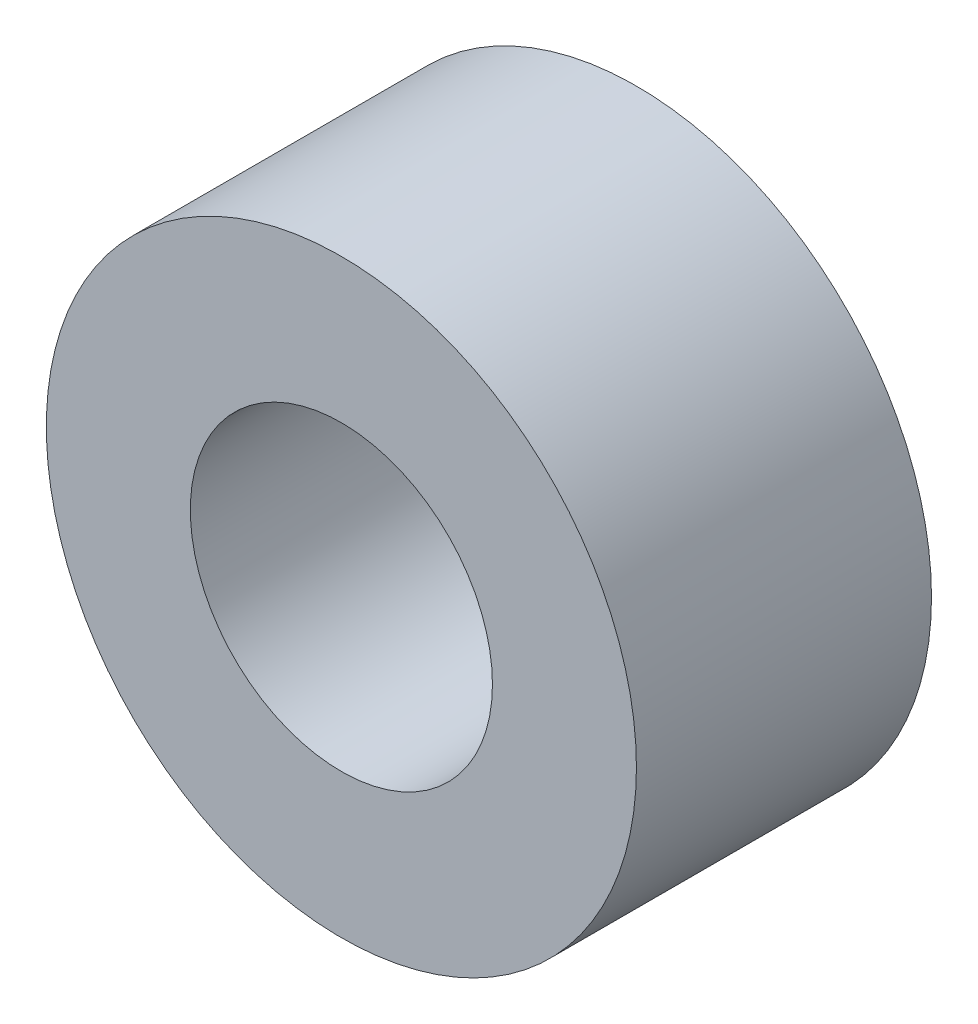
ISO-10303-21;
HEADER;
FILE_DESCRIPTION(('STEP AP214'),'2;1');
FILE_NAME('part.step','',(''),(''),'','','');
FILE_SCHEMA(('AUTOMOTIVE_DESIGN { 1 0 10303 214 1 1 1 1 }'));
ENDSEC;
DATA;
#1=APPLICATION_CONTEXT('core data for automotive mechanical design processes');
#2=APPLICATION_PROTOCOL_DEFINITION('international standard','automotive_design',2000,#1);
#3=PRODUCT_CONTEXT('',#1,'mechanical');
#4=PRODUCT('Part','Part','',(#3));
#5=PRODUCT_RELATED_PRODUCT_CATEGORY('part','',(#4));
#6=PRODUCT_DEFINITION_FORMATION('','',#4);
#7=PRODUCT_DEFINITION_CONTEXT('part definition',#1,'design');
#8=PRODUCT_DEFINITION('design','',#6,#7);
#9=PRODUCT_DEFINITION_SHAPE('','',#8);
#10=(LENGTH_UNIT() NAMED_UNIT(*) SI_UNIT(.MILLI.,.METRE.));
#11=(NAMED_UNIT(*) PLANE_ANGLE_UNIT() SI_UNIT($,.RADIAN.));
#12=(NAMED_UNIT(*) SI_UNIT($,.STERADIAN.) SOLID_ANGLE_UNIT());
#13=UNCERTAINTY_MEASURE_WITH_UNIT(LENGTH_MEASURE(1.E-05),#10,'distance_accuracy_value','');
#14=(GEOMETRIC_REPRESENTATION_CONTEXT(3) GLOBAL_UNCERTAINTY_ASSIGNED_CONTEXT((#13)) GLOBAL_UNIT_ASSIGNED_CONTEXT((#10,
#11,#12)) REPRESENTATION_CONTEXT('',''));
#15=CARTESIAN_POINT('',(0.,0.,0.));
#16=DIRECTION('',(0.,0.,1.));
#17=DIRECTION('',(1.,0.,0.));
#18=AXIS2_PLACEMENT_3D('',#15,#16,#17);
#19=CARTESIAN_POINT('',(0.,0.,0.79375));
#20=DIRECTION('',(0.,0.,1.));
#21=DIRECTION('',(1.,0.,0.));
#22=AXIS2_PLACEMENT_3D('',#19,#20,#21);
#23=PLANE('',#22);
#24=CARTESIAN_POINT('',(0.,0.,0.79375));
#25=DIRECTION('',(0.,0.,1.));
#26=DIRECTION('',(1.,0.,0.));
#27=AXIS2_PLACEMENT_3D('',#24,#25,#26);
#28=CIRCLE('',#27,1.5875);
#29=CARTESIAN_POINT('',(1.5875,0.,0.79375));
#30=VERTEX_POINT('',#29);
#31=EDGE_CURVE('E10',#30,#30,#28,.T.);
#32=ORIENTED_EDGE('',*,*,#31,.T.);
#33=EDGE_LOOP('',(#32));
#34=FACE_BOUND('',#33,.T.);
#35=CARTESIAN_POINT('',(0.,0.,0.79375));
#36=DIRECTION('',(0.,0.,1.));
#37=DIRECTION('',(1.,0.,0.));
#38=AXIS2_PLACEMENT_3D('',#35,#36,#37);
#39=CIRCLE('',#38,0.8128);
#40=CARTESIAN_POINT('',(0.8128,0.,0.79375));
#41=VERTEX_POINT('',#40);
#42=EDGE_CURVE('E48',#41,#41,#39,.T.);
#43=ORIENTED_EDGE('',*,*,#42,.F.);
#44=EDGE_LOOP('',(#43));
#45=FACE_BOUND('',#44,.T.);
#46=ADVANCED_FACE('F34',(#34,#45),#23,.T.);
#47=CARTESIAN_POINT('',(0.,0.,-0.79375));
#48=DIRECTION('',(0.,0.,1.));
#49=DIRECTION('',(1.,0.,0.));
#50=AXIS2_PLACEMENT_3D('',#47,#48,#49);
#51=PLANE('',#50);
#52=CARTESIAN_POINT('',(0.,0.,-0.79375));
#53=DIRECTION('',(0.,0.,1.));
#54=DIRECTION('',(1.,0.,0.));
#55=AXIS2_PLACEMENT_3D('',#52,#53,#54);
#56=CIRCLE('',#55,1.5875);
#57=CARTESIAN_POINT('',(1.5875,0.,-0.79375));
#58=VERTEX_POINT('',#57);
#59=EDGE_CURVE('E38',#58,#58,#56,.T.);
#60=ORIENTED_EDGE('',*,*,#59,.F.);
#61=EDGE_LOOP('',(#60));
#62=FACE_BOUND('',#61,.T.);
#63=CARTESIAN_POINT('',(0.,0.,-0.79375));
#64=DIRECTION('',(0.,0.,1.));
#65=DIRECTION('',(1.,0.,0.));
#66=AXIS2_PLACEMENT_3D('',#63,#64,#65);
#67=CIRCLE('',#66,0.8128);
#68=CARTESIAN_POINT('',(0.8128,0.,-0.79375));
#69=VERTEX_POINT('',#68);
#70=EDGE_CURVE('E50',#69,#69,#67,.T.);
#71=ORIENTED_EDGE('',*,*,#70,.T.);
#72=EDGE_LOOP('',(#71));
#73=FACE_BOUND('',#72,.T.);
#74=ADVANCED_FACE('F61',(#62,#73),#51,.F.);
#75=CARTESIAN_POINT('',(0.,0.,0.79375));
#76=DIRECTION('',(0.,0.,-1.));
#77=DIRECTION('',(-1.,0.,0.));
#78=AXIS2_PLACEMENT_3D('',#75,#76,#77);
#79=CYLINDRICAL_SURFACE('',#78,1.5875);
#80=ORIENTED_EDGE('',*,*,#31,.F.);
#81=EDGE_LOOP('',(#80));
#82=FACE_BOUND('',#81,.T.);
#83=ORIENTED_EDGE('',*,*,#59,.T.);
#84=EDGE_LOOP('',(#83));
#85=FACE_BOUND('',#84,.T.);
#86=ADVANCED_FACE('F36',(#82,#85),#79,.T.);
#87=CARTESIAN_POINT('',(0.,0.,0.79375));
#88=DIRECTION('',(0.,0.,-1.));
#89=DIRECTION('',(-1.,0.,0.));
#90=AXIS2_PLACEMENT_3D('',#87,#88,#89);
#91=CYLINDRICAL_SURFACE('',#90,0.8128);
#92=ORIENTED_EDGE('',*,*,#42,.T.);
#93=EDGE_LOOP('',(#92));
#94=FACE_BOUND('',#93,.T.);
#95=ORIENTED_EDGE('',*,*,#70,.F.);
#96=EDGE_LOOP('',(#95));
#97=FACE_BOUND('',#96,.T.);
#98=ADVANCED_FACE('F57',(#94,#97),#91,.F.);
#99=CLOSED_SHELL('',(#46,#74,#86,#98));
#100=MANIFOLD_SOLID_BREP('B2',#99);
#101=ADVANCED_BREP_SHAPE_REPRESENTATION('',(#18,#100),#14);
#102=SHAPE_DEFINITION_REPRESENTATION(#9,#101);
ENDSEC;
END-ISO-10303-21;
